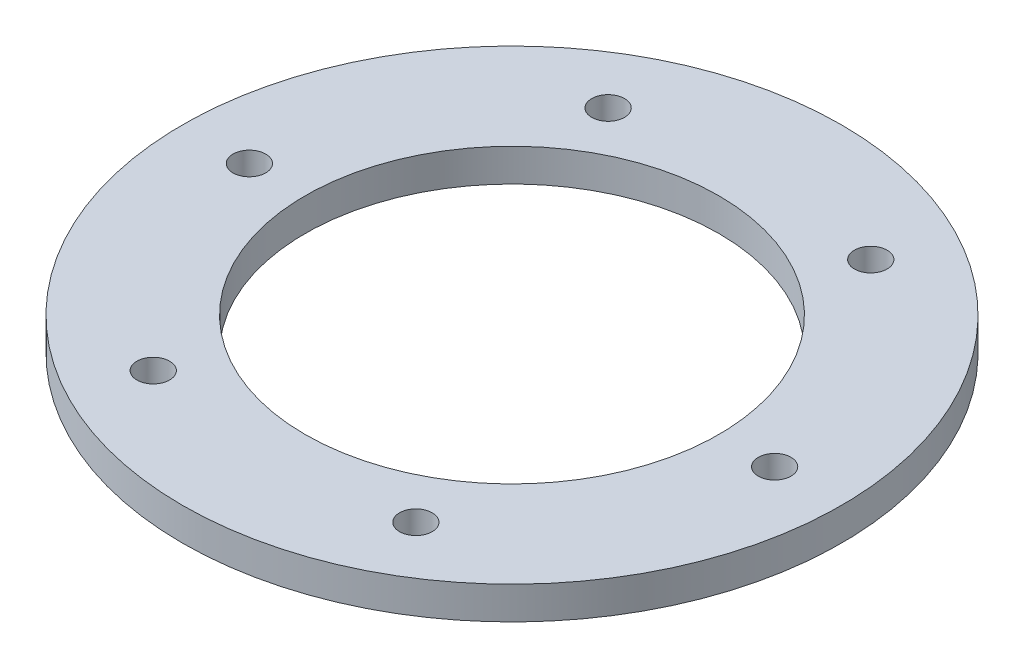
ISO-10303-21;
HEADER;
FILE_DESCRIPTION(('STEP AP214'),'2;1');
FILE_NAME('part.step','',(''),(''),'','','');
FILE_SCHEMA(('AUTOMOTIVE_DESIGN { 1 0 10303 214 1 1 1 1 }'));
ENDSEC;
DATA;
#1=APPLICATION_CONTEXT('core data for automotive mechanical design processes');
#2=APPLICATION_PROTOCOL_DEFINITION('international standard','automotive_design',2000,#1);
#3=PRODUCT_CONTEXT('',#1,'mechanical');
#4=PRODUCT('Part','Part','',(#3));
#5=PRODUCT_RELATED_PRODUCT_CATEGORY('part','',(#4));
#6=PRODUCT_DEFINITION_FORMATION('','',#4);
#7=PRODUCT_DEFINITION_CONTEXT('part definition',#1,'design');
#8=PRODUCT_DEFINITION('design','',#6,#7);
#9=PRODUCT_DEFINITION_SHAPE('','',#8);
#10=(LENGTH_UNIT() NAMED_UNIT(*) SI_UNIT(.MILLI.,.METRE.));
#11=(NAMED_UNIT(*) PLANE_ANGLE_UNIT() SI_UNIT($,.RADIAN.));
#12=(NAMED_UNIT(*) SI_UNIT($,.STERADIAN.) SOLID_ANGLE_UNIT());
#13=UNCERTAINTY_MEASURE_WITH_UNIT(LENGTH_MEASURE(1.E-05),#10,'distance_accuracy_value','');
#14=(GEOMETRIC_REPRESENTATION_CONTEXT(3) GLOBAL_UNCERTAINTY_ASSIGNED_CONTEXT((#13)) GLOBAL_UNIT_ASSIGNED_CONTEXT((#10,
#11,#12)) REPRESENTATION_CONTEXT('',''));
#15=CARTESIAN_POINT('',(0.,0.,0.));
#16=DIRECTION('',(0.,0.,1.));
#17=DIRECTION('',(1.,0.,0.));
#18=AXIS2_PLACEMENT_3D('',#15,#16,#17);
#19=CARTESIAN_POINT('',(0.,0.,0.));
#20=DIRECTION('',(0.,-1.,0.));
#21=DIRECTION('',(0.,0.,-1.));
#22=AXIS2_PLACEMENT_3D('',#19,#20,#21);
#23=CYLINDRICAL_SURFACE('',#22,40.28);
#24=CARTESIAN_POINT('',(0.,4.,0.));
#25=DIRECTION('',(0.,-1.,0.));
#26=DIRECTION('',(0.,0.,-1.));
#27=AXIS2_PLACEMENT_3D('',#24,#25,#26);
#28=CIRCLE('',#27,40.28);
#29=CARTESIAN_POINT('',(0.,4.,-40.28));
#30=VERTEX_POINT('',#29);
#31=EDGE_CURVE('E10',#30,#30,#28,.T.);
#32=ORIENTED_EDGE('',*,*,#31,.T.);
#33=EDGE_LOOP('',(#32));
#34=FACE_BOUND('',#33,.T.);
#35=CARTESIAN_POINT('',(0.,0.,0.));
#36=DIRECTION('',(0.,-1.,0.));
#37=DIRECTION('',(0.,0.,-1.));
#38=AXIS2_PLACEMENT_3D('',#35,#36,#37);
#39=CIRCLE('',#38,40.28);
#40=CARTESIAN_POINT('',(0.,0.,-40.28));
#41=VERTEX_POINT('',#40);
#42=EDGE_CURVE('E72',#41,#41,#39,.T.);
#43=ORIENTED_EDGE('',*,*,#42,.F.);
#44=EDGE_LOOP('',(#43));
#45=FACE_BOUND('',#44,.T.);
#46=ADVANCED_FACE('F39',(#34,#45),#23,.T.);
#47=CARTESIAN_POINT('',(40.28,4.,0.));
#48=DIRECTION('',(0.,1.,0.));
#49=DIRECTION('',(0.,0.,1.));
#50=AXIS2_PLACEMENT_3D('',#47,#48,#49);
#51=PLANE('',#50);
#52=CARTESIAN_POINT('',(-32.1,4.,0.));
#53=DIRECTION('',(0.,1.,0.));
#54=DIRECTION('',(0.,0.,1.));
#55=AXIS2_PLACEMENT_3D('',#52,#53,#54);
#56=CIRCLE('',#55,2.);
#57=CARTESIAN_POINT('',(-32.1,4.,2.));
#58=VERTEX_POINT('',#57);
#59=EDGE_CURVE('E59',#58,#58,#56,.T.);
#60=ORIENTED_EDGE('',*,*,#59,.F.);
#61=EDGE_LOOP('',(#60));
#62=FACE_BOUND('',#61,.T.);
#63=CARTESIAN_POINT('',(-16.05,4.,27.7994154614806));
#64=DIRECTION('',(0.,1.,0.));
#65=DIRECTION('',(0.,0.,1.));
#66=AXIS2_PLACEMENT_3D('',#63,#64,#65);
#67=CIRCLE('',#66,2.00000000000001);
#68=CARTESIAN_POINT('',(-16.05,4.,29.7994154614806));
#69=VERTEX_POINT('',#68);
#70=EDGE_CURVE('E85',#69,#69,#67,.T.);
#71=ORIENTED_EDGE('',*,*,#70,.F.);
#72=EDGE_LOOP('',(#71));
#73=FACE_BOUND('',#72,.T.);
#74=CARTESIAN_POINT('',(16.0500000000001,4.,27.7994154614806));
#75=DIRECTION('',(0.,1.,0.));
#76=DIRECTION('',(0.,0.,1.));
#77=AXIS2_PLACEMENT_3D('',#74,#75,#76);
#78=CIRCLE('',#77,2.);
#79=CARTESIAN_POINT('',(16.0500000000001,4.,29.7994154614806));
#80=VERTEX_POINT('',#79);
#81=EDGE_CURVE('E81',#80,#80,#78,.T.);
#82=ORIENTED_EDGE('',*,*,#81,.F.);
#83=EDGE_LOOP('',(#82));
#84=FACE_BOUND('',#83,.T.);
#85=CARTESIAN_POINT('',(32.1000000000002,4.,0.));
#86=DIRECTION('',(0.,1.,0.));
#87=DIRECTION('',(0.,0.,1.));
#88=AXIS2_PLACEMENT_3D('',#85,#86,#87);
#89=CIRCLE('',#88,2.);
#90=CARTESIAN_POINT('',(32.1000000000002,4.,2.0000000000001));
#91=VERTEX_POINT('',#90);
#92=EDGE_CURVE('E84',#91,#91,#89,.T.);
#93=ORIENTED_EDGE('',*,*,#92,.F.);
#94=EDGE_LOOP('',(#93));
#95=FACE_BOUND('',#94,.T.);
#96=CARTESIAN_POINT('',(16.0500000000002,4.,-27.7994154614805));
#97=DIRECTION('',(0.,1.,0.));
#98=DIRECTION('',(0.,0.,1.));
#99=AXIS2_PLACEMENT_3D('',#96,#97,#98);
#100=CIRCLE('',#99,2.00000000000001);
#101=CARTESIAN_POINT('',(16.0500000000002,4.,-25.7994154614805));
#102=VERTEX_POINT('',#101);
#103=EDGE_CURVE('E88',#102,#102,#100,.T.);
#104=ORIENTED_EDGE('',*,*,#103,.F.);
#105=EDGE_LOOP('',(#104));
#106=FACE_BOUND('',#105,.T.);
#107=CARTESIAN_POINT('',(-16.05,4.,-27.7994154614805));
#108=DIRECTION('',(0.,1.,0.));
#109=DIRECTION('',(0.,0.,1.));
#110=AXIS2_PLACEMENT_3D('',#107,#108,#109);
#111=CIRCLE('',#110,2.00000000000008);
#112=CARTESIAN_POINT('',(-16.05,4.,-25.7994154614804));
#113=VERTEX_POINT('',#112);
#114=EDGE_CURVE('E91',#113,#113,#111,.T.);
#115=ORIENTED_EDGE('',*,*,#114,.F.);
#116=EDGE_LOOP('',(#115));
#117=FACE_BOUND('',#116,.T.);
#118=CARTESIAN_POINT('',(0.,4.,0.));
#119=DIRECTION('',(0.,-1.,0.));
#120=DIRECTION('',(0.,0.,-1.));
#121=AXIS2_PLACEMENT_3D('',#118,#119,#120);
#122=CIRCLE('',#121,25.28);
#123=CARTESIAN_POINT('',(0.,4.,-25.28));
#124=VERTEX_POINT('',#123);
#125=EDGE_CURVE('E46',#124,#124,#122,.T.);
#126=ORIENTED_EDGE('',*,*,#125,.T.);
#127=EDGE_LOOP('',(#126));
#128=FACE_BOUND('',#127,.T.);
#129=ORIENTED_EDGE('',*,*,#31,.F.);
#130=EDGE_LOOP('',(#129));
#131=FACE_BOUND('',#130,.T.);
#132=ADVANCED_FACE('F101',(#62,#73,#84,#95,#106,#117,#128,#131),#51,.T.);
#133=CARTESIAN_POINT('',(0.,0.,0.));
#134=DIRECTION('',(0.,-1.,0.));
#135=DIRECTION('',(0.,0.,-1.));
#136=AXIS2_PLACEMENT_3D('',#133,#134,#135);
#137=CYLINDRICAL_SURFACE('',#136,25.28);
#138=CARTESIAN_POINT('',(0.,0.,0.));
#139=DIRECTION('',(0.,-1.,0.));
#140=DIRECTION('',(0.,0.,-1.));
#141=AXIS2_PLACEMENT_3D('',#138,#139,#140);
#142=CIRCLE('',#141,25.28);
#143=CARTESIAN_POINT('',(0.,0.,-25.28));
#144=VERTEX_POINT('',#143);
#145=EDGE_CURVE('E51',#144,#144,#142,.T.);
#146=ORIENTED_EDGE('',*,*,#145,.T.);
#147=EDGE_LOOP('',(#146));
#148=FACE_BOUND('',#147,.T.);
#149=ORIENTED_EDGE('',*,*,#125,.F.);
#150=EDGE_LOOP('',(#149));
#151=FACE_BOUND('',#150,.T.);
#152=ADVANCED_FACE('F104',(#148,#151),#137,.F.);
#153=CARTESIAN_POINT('',(25.28,0.,0.));
#154=DIRECTION('',(0.,-1.,0.));
#155=DIRECTION('',(0.,0.,-1.));
#156=AXIS2_PLACEMENT_3D('',#153,#154,#155);
#157=PLANE('',#156);
#158=CARTESIAN_POINT('',(-32.1,0.,0.));
#159=DIRECTION('',(0.,-1.,0.));
#160=DIRECTION('',(0.,0.,-1.));
#161=AXIS2_PLACEMENT_3D('',#158,#159,#160);
#162=CIRCLE('',#161,2.);
#163=CARTESIAN_POINT('',(-32.1,0.,-2.));
#164=VERTEX_POINT('',#163);
#165=EDGE_CURVE('E42',#164,#164,#162,.T.);
#166=ORIENTED_EDGE('',*,*,#165,.F.);
#167=EDGE_LOOP('',(#166));
#168=FACE_BOUND('',#167,.T.);
#169=CARTESIAN_POINT('',(-16.05,0.,27.7994154614806));
#170=DIRECTION('',(0.,-1.,0.));
#171=DIRECTION('',(0.,0.,-1.));
#172=AXIS2_PLACEMENT_3D('',#169,#170,#171);
#173=CIRCLE('',#172,2.00000000000001);
#174=CARTESIAN_POINT('',(-16.05,0.,25.7994154614806));
#175=VERTEX_POINT('',#174);
#176=EDGE_CURVE('E67',#175,#175,#173,.T.);
#177=ORIENTED_EDGE('',*,*,#176,.F.);
#178=EDGE_LOOP('',(#177));
#179=FACE_BOUND('',#178,.T.);
#180=CARTESIAN_POINT('',(16.0500000000001,0.,27.7994154614806));
#181=DIRECTION('',(0.,-1.,0.));
#182=DIRECTION('',(0.,0.,-1.));
#183=AXIS2_PLACEMENT_3D('',#180,#181,#182);
#184=CIRCLE('',#183,2.);
#185=CARTESIAN_POINT('',(16.0500000000001,0.,25.7994154614806));
#186=VERTEX_POINT('',#185);
#187=EDGE_CURVE('E65',#186,#186,#184,.T.);
#188=ORIENTED_EDGE('',*,*,#187,.F.);
#189=EDGE_LOOP('',(#188));
#190=FACE_BOUND('',#189,.T.);
#191=CARTESIAN_POINT('',(32.1000000000002,0.,0.));
#192=DIRECTION('',(0.,-1.,0.));
#193=DIRECTION('',(0.,0.,-1.));
#194=AXIS2_PLACEMENT_3D('',#191,#192,#193);
#195=CIRCLE('',#194,2.);
#196=CARTESIAN_POINT('',(32.1000000000002,0.,-1.99999999999991));
#197=VERTEX_POINT('',#196);
#198=EDGE_CURVE('E62',#197,#197,#195,.T.);
#199=ORIENTED_EDGE('',*,*,#198,.F.);
#200=EDGE_LOOP('',(#199));
#201=FACE_BOUND('',#200,.T.);
#202=CARTESIAN_POINT('',(16.0500000000002,0.,-27.7994154614805));
#203=DIRECTION('',(0.,-1.,0.));
#204=DIRECTION('',(0.,0.,-1.));
#205=AXIS2_PLACEMENT_3D('',#202,#203,#204);
#206=CIRCLE('',#205,2.00000000000001);
#207=CARTESIAN_POINT('',(16.0500000000002,0.,-29.7994154614805));
#208=VERTEX_POINT('',#207);
#209=EDGE_CURVE('E58',#208,#208,#206,.T.);
#210=ORIENTED_EDGE('',*,*,#209,.F.);
#211=EDGE_LOOP('',(#210));
#212=FACE_BOUND('',#211,.T.);
#213=CARTESIAN_POINT('',(-16.05,0.,-27.7994154614805));
#214=DIRECTION('',(0.,-1.,0.));
#215=DIRECTION('',(0.,0.,-1.));
#216=AXIS2_PLACEMENT_3D('',#213,#214,#215);
#217=CIRCLE('',#216,2.00000000000008);
#218=CARTESIAN_POINT('',(-16.05,0.,-29.7994154614806));
#219=VERTEX_POINT('',#218);
#220=EDGE_CURVE('E55',#219,#219,#217,.T.);
#221=ORIENTED_EDGE('',*,*,#220,.F.);
#222=EDGE_LOOP('',(#221));
#223=FACE_BOUND('',#222,.T.);
#224=ORIENTED_EDGE('',*,*,#42,.T.);
#225=EDGE_LOOP('',(#224));
#226=FACE_BOUND('',#225,.T.);
#227=ORIENTED_EDGE('',*,*,#145,.F.);
#228=EDGE_LOOP('',(#227));
#229=FACE_BOUND('',#228,.T.);
#230=ADVANCED_FACE('F119',(#168,#179,#190,#201,#212,#223,#226,#229),#157,.T.);
#231=CARTESIAN_POINT('',(-16.05,-6.,-27.7994154614805));
#232=DIRECTION('',(0.,1.,0.));
#233=DIRECTION('',(0.,0.,1.));
#234=AXIS2_PLACEMENT_3D('',#231,#232,#233);
#235=CYLINDRICAL_SURFACE('',#234,2.00000000000008);
#236=ORIENTED_EDGE('',*,*,#220,.T.);
#237=EDGE_LOOP('',(#236));
#238=FACE_BOUND('',#237,.T.);
#239=ORIENTED_EDGE('',*,*,#114,.T.);
#240=EDGE_LOOP('',(#239));
#241=FACE_BOUND('',#240,.T.);
#242=ADVANCED_FACE('F126',(#238,#241),#235,.F.);
#243=CARTESIAN_POINT('',(16.0500000000002,-6.,-27.7994154614805));
#244=DIRECTION('',(0.,1.,0.));
#245=DIRECTION('',(0.,0.,1.));
#246=AXIS2_PLACEMENT_3D('',#243,#244,#245);
#247=CYLINDRICAL_SURFACE('',#246,2.00000000000001);
#248=ORIENTED_EDGE('',*,*,#209,.T.);
#249=EDGE_LOOP('',(#248));
#250=FACE_BOUND('',#249,.T.);
#251=ORIENTED_EDGE('',*,*,#103,.T.);
#252=EDGE_LOOP('',(#251));
#253=FACE_BOUND('',#252,.T.);
#254=ADVANCED_FACE('F158',(#250,#253),#247,.F.);
#255=CARTESIAN_POINT('',(32.1000000000002,-6.,0.));
#256=DIRECTION('',(0.,1.,0.));
#257=DIRECTION('',(0.,0.,1.));
#258=AXIS2_PLACEMENT_3D('',#255,#256,#257);
#259=CYLINDRICAL_SURFACE('',#258,2.);
#260=ORIENTED_EDGE('',*,*,#198,.T.);
#261=EDGE_LOOP('',(#260));
#262=FACE_BOUND('',#261,.T.);
#263=ORIENTED_EDGE('',*,*,#92,.T.);
#264=EDGE_LOOP('',(#263));
#265=FACE_BOUND('',#264,.T.);
#266=ADVANCED_FACE('F168',(#262,#265),#259,.F.);
#267=CARTESIAN_POINT('',(16.0500000000001,-6.,27.7994154614806));
#268=DIRECTION('',(0.,1.,0.));
#269=DIRECTION('',(0.,0.,1.));
#270=AXIS2_PLACEMENT_3D('',#267,#268,#269);
#271=CYLINDRICAL_SURFACE('',#270,2.);
#272=ORIENTED_EDGE('',*,*,#187,.T.);
#273=EDGE_LOOP('',(#272));
#274=FACE_BOUND('',#273,.T.);
#275=ORIENTED_EDGE('',*,*,#81,.T.);
#276=EDGE_LOOP('',(#275));
#277=FACE_BOUND('',#276,.T.);
#278=ADVANCED_FACE('F178',(#274,#277),#271,.F.);
#279=CARTESIAN_POINT('',(-16.05,-6.,27.7994154614806));
#280=DIRECTION('',(0.,1.,0.));
#281=DIRECTION('',(0.,0.,1.));
#282=AXIS2_PLACEMENT_3D('',#279,#280,#281);
#283=CYLINDRICAL_SURFACE('',#282,2.00000000000001);
#284=ORIENTED_EDGE('',*,*,#176,.T.);
#285=EDGE_LOOP('',(#284));
#286=FACE_BOUND('',#285,.T.);
#287=ORIENTED_EDGE('',*,*,#70,.T.);
#288=EDGE_LOOP('',(#287));
#289=FACE_BOUND('',#288,.T.);
#290=ADVANCED_FACE('F188',(#286,#289),#283,.F.);
#291=CARTESIAN_POINT('',(-32.1,-6.,0.));
#292=DIRECTION('',(0.,1.,0.));
#293=DIRECTION('',(0.,0.,1.));
#294=AXIS2_PLACEMENT_3D('',#291,#292,#293);
#295=CYLINDRICAL_SURFACE('',#294,2.);
#296=ORIENTED_EDGE('',*,*,#165,.T.);
#297=EDGE_LOOP('',(#296));
#298=FACE_BOUND('',#297,.T.);
#299=ORIENTED_EDGE('',*,*,#59,.T.);
#300=EDGE_LOOP('',(#299));
#301=FACE_BOUND('',#300,.T.);
#302=ADVANCED_FACE('F99',(#298,#301),#295,.F.);
#303=CLOSED_SHELL('',(#46,#132,#152,#230,#242,#254,#266,#278,#290,#302));
#304=MANIFOLD_SOLID_BREP('B2',#303);
#305=ADVANCED_BREP_SHAPE_REPRESENTATION('',(#18,#304),#14);
#306=SHAPE_DEFINITION_REPRESENTATION(#9,#305);
ENDSEC;
END-ISO-10303-21;
